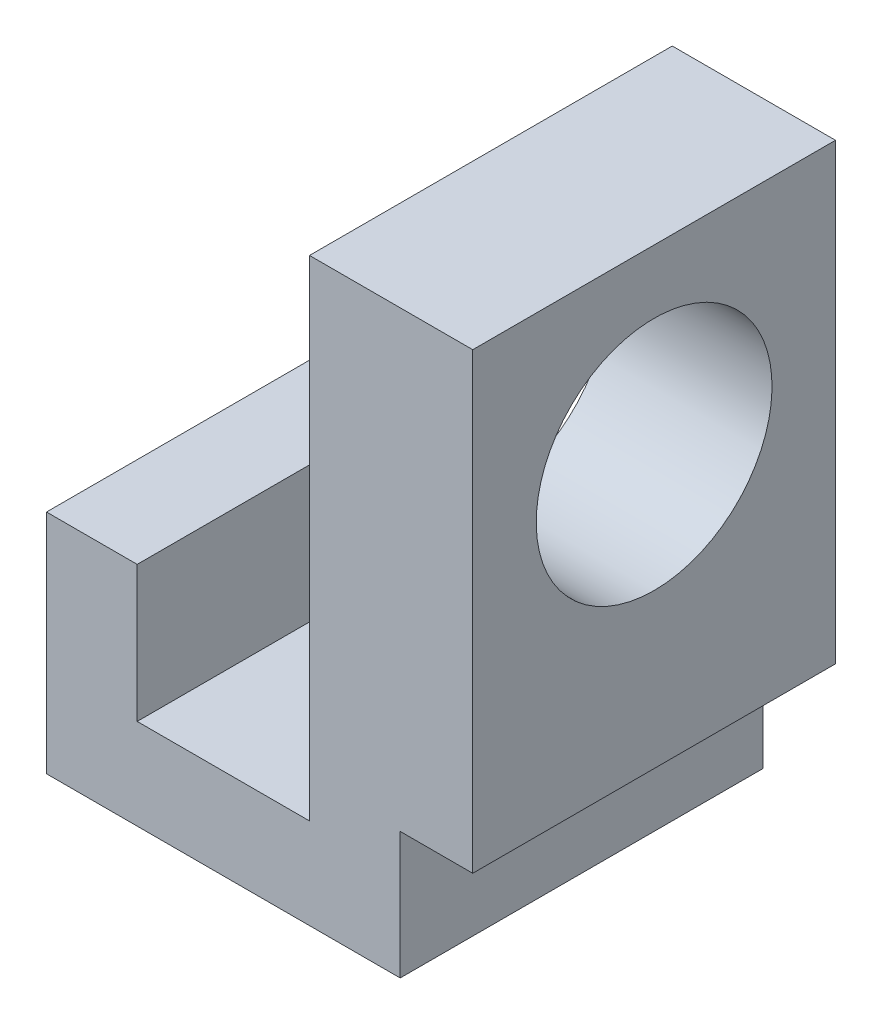
ISO-10303-21;
HEADER;
FILE_DESCRIPTION(('STEP AP214'),'2;1');
FILE_NAME('part.step','',(''),(''),'','','');
FILE_SCHEMA(('AUTOMOTIVE_DESIGN { 1 0 10303 214 1 1 1 1 }'));
ENDSEC;
DATA;
#1=APPLICATION_CONTEXT('core data for automotive mechanical design processes');
#2=APPLICATION_PROTOCOL_DEFINITION('international standard','automotive_design',2000,#1);
#3=PRODUCT_CONTEXT('',#1,'mechanical');
#4=PRODUCT('Part','Part','',(#3));
#5=PRODUCT_RELATED_PRODUCT_CATEGORY('part','',(#4));
#6=PRODUCT_DEFINITION_FORMATION('','',#4);
#7=PRODUCT_DEFINITION_CONTEXT('part definition',#1,'design');
#8=PRODUCT_DEFINITION('design','',#6,#7);
#9=PRODUCT_DEFINITION_SHAPE('','',#8);
#10=(LENGTH_UNIT() NAMED_UNIT(*) SI_UNIT(.MILLI.,.METRE.));
#11=(NAMED_UNIT(*) PLANE_ANGLE_UNIT() SI_UNIT($,.RADIAN.));
#12=(NAMED_UNIT(*) SI_UNIT($,.STERADIAN.) SOLID_ANGLE_UNIT());
#13=UNCERTAINTY_MEASURE_WITH_UNIT(LENGTH_MEASURE(1.E-05),#10,'distance_accuracy_value','');
#14=(GEOMETRIC_REPRESENTATION_CONTEXT(3) GLOBAL_UNCERTAINTY_ASSIGNED_CONTEXT((#13)) GLOBAL_UNIT_ASSIGNED_CONTEXT((#10,
#11,#12)) REPRESENTATION_CONTEXT('',''));
#15=CARTESIAN_POINT('',(0.,0.,0.));
#16=DIRECTION('',(0.,0.,1.));
#17=DIRECTION('',(1.,0.,0.));
#18=AXIS2_PLACEMENT_3D('',#15,#16,#17);
#19=CARTESIAN_POINT('',(0.,25.,-40.));
#20=DIRECTION('',(-1.,0.,0.));
#21=DIRECTION('',(0.,-1.,0.));
#22=AXIS2_PLACEMENT_3D('',#19,#20,#21);
#23=PLANE('',#22);
#24=DIRECTION('',(0.,-1.,0.));
#25=VECTOR('',#24,1.);
#26=CARTESIAN_POINT('',(0.,25.,0.));
#27=LINE('',#26,#25);
#28=CARTESIAN_POINT('',(0.,25.,0.));
#29=VERTEX_POINT('',#28);
#30=CARTESIAN_POINT('',(0.,0.,0.));
#31=VERTEX_POINT('',#30);
#32=EDGE_CURVE('E142',#29,#31,#27,.T.);
#33=ORIENTED_EDGE('',*,*,#32,.F.);
#34=DIRECTION('',(0.,0.,1.));
#35=VECTOR('',#34,1.);
#36=CARTESIAN_POINT('',(0.,25.,-40.));
#37=LINE('',#36,#35);
#38=CARTESIAN_POINT('',(0.,25.,-40.));
#39=VERTEX_POINT('',#38);
#40=EDGE_CURVE('E11',#39,#29,#37,.T.);
#41=ORIENTED_EDGE('',*,*,#40,.F.);
#42=DIRECTION('',(0.,-1.,0.));
#43=VECTOR('',#42,1.);
#44=CARTESIAN_POINT('',(0.,25.,-40.));
#45=LINE('',#44,#43);
#46=CARTESIAN_POINT('',(0.,0.,-40.));
#47=VERTEX_POINT('',#46);
#48=EDGE_CURVE('E169',#39,#47,#45,.T.);
#49=ORIENTED_EDGE('',*,*,#48,.T.);
#50=DIRECTION('',(0.,0.,1.));
#51=VECTOR('',#50,1.);
#52=CARTESIAN_POINT('',(0.,0.,-40.));
#53=LINE('',#52,#51);
#54=EDGE_CURVE('E36',#47,#31,#53,.T.);
#55=ORIENTED_EDGE('',*,*,#54,.T.);
#56=EDGE_LOOP('',(#33,#41,#49,#55));
#57=FACE_BOUND('',#56,.T.);
#58=ADVANCED_FACE('F33',(#57),#23,.T.);
#59=CARTESIAN_POINT('',(10.,25.,-40.));
#60=DIRECTION('',(0.,1.,0.));
#61=DIRECTION('',(0.,0.,1.));
#62=AXIS2_PLACEMENT_3D('',#59,#60,#61);
#63=PLANE('',#62);
#64=DIRECTION('',(-1.,0.,0.));
#65=VECTOR('',#64,1.);
#66=CARTESIAN_POINT('',(10.,25.,0.));
#67=LINE('',#66,#65);
#68=CARTESIAN_POINT('',(10.,25.,0.));
#69=VERTEX_POINT('',#68);
#70=EDGE_CURVE('E167',#69,#29,#67,.T.);
#71=ORIENTED_EDGE('',*,*,#70,.F.);
#72=DIRECTION('',(0.,0.,1.));
#73=VECTOR('',#72,1.);
#74=CARTESIAN_POINT('',(10.,25.,-40.));
#75=LINE('',#74,#73);
#76=CARTESIAN_POINT('',(10.,25.,-40.));
#77=VERTEX_POINT('',#76);
#78=EDGE_CURVE('E42',#77,#69,#75,.T.);
#79=ORIENTED_EDGE('',*,*,#78,.F.);
#80=DIRECTION('',(-1.,0.,0.));
#81=VECTOR('',#80,1.);
#82=CARTESIAN_POINT('',(10.,25.,-40.));
#83=LINE('',#82,#81);
#84=EDGE_CURVE('E132',#77,#39,#83,.T.);
#85=ORIENTED_EDGE('',*,*,#84,.T.);
#86=ORIENTED_EDGE('',*,*,#40,.T.);
#87=EDGE_LOOP('',(#71,#79,#85,#86));
#88=FACE_BOUND('',#87,.T.);
#89=ADVANCED_FACE('F185',(#88),#63,.T.);
#90=CARTESIAN_POINT('',(10.,10.,-40.));
#91=DIRECTION('',(1.,0.,0.));
#92=DIRECTION('',(0.,0.,-1.));
#93=AXIS2_PLACEMENT_3D('',#90,#91,#92);
#94=PLANE('',#93);
#95=DIRECTION('',(0.,1.,0.));
#96=VECTOR('',#95,1.);
#97=CARTESIAN_POINT('',(10.,10.,0.));
#98=LINE('',#97,#96);
#99=CARTESIAN_POINT('',(10.,10.,0.));
#100=VERTEX_POINT('',#99);
#101=EDGE_CURVE('E119',#100,#69,#98,.T.);
#102=ORIENTED_EDGE('',*,*,#101,.F.);
#103=DIRECTION('',(0.,0.,1.));
#104=VECTOR('',#103,1.);
#105=CARTESIAN_POINT('',(10.,10.,-40.));
#106=LINE('',#105,#104);
#107=CARTESIAN_POINT('',(10.,10.,-40.));
#108=VERTEX_POINT('',#107);
#109=EDGE_CURVE('E114',#108,#100,#106,.T.);
#110=ORIENTED_EDGE('',*,*,#109,.F.);
#111=DIRECTION('',(0.,1.,0.));
#112=VECTOR('',#111,1.);
#113=CARTESIAN_POINT('',(10.,10.,-40.));
#114=LINE('',#113,#112);
#115=EDGE_CURVE('E117',#108,#77,#114,.T.);
#116=ORIENTED_EDGE('',*,*,#115,.T.);
#117=ORIENTED_EDGE('',*,*,#78,.T.);
#118=EDGE_LOOP('',(#102,#110,#116,#117));
#119=FACE_BOUND('',#118,.T.);
#120=ADVANCED_FACE('F116',(#119),#94,.T.);
#121=CARTESIAN_POINT('',(29.,10.,-40.));
#122=DIRECTION('',(0.,1.,0.));
#123=DIRECTION('',(-1.,0.,0.));
#124=AXIS2_PLACEMENT_3D('',#121,#122,#123);
#125=PLANE('',#124);
#126=DIRECTION('',(-1.,0.,0.));
#127=VECTOR('',#126,1.);
#128=CARTESIAN_POINT('',(29.,10.,0.));
#129=LINE('',#128,#127);
#130=CARTESIAN_POINT('',(29.,10.,0.));
#131=VERTEX_POINT('',#130);
#132=EDGE_CURVE('E164',#131,#100,#129,.T.);
#133=ORIENTED_EDGE('',*,*,#132,.F.);
#134=DIRECTION('',(0.,0.,1.));
#135=VECTOR('',#134,1.);
#136=CARTESIAN_POINT('',(29.,10.,-40.));
#137=LINE('',#136,#135);
#138=CARTESIAN_POINT('',(29.,10.,-40.));
#139=VERTEX_POINT('',#138);
#140=EDGE_CURVE('E124',#139,#131,#137,.T.);
#141=ORIENTED_EDGE('',*,*,#140,.F.);
#142=DIRECTION('',(-1.,0.,0.));
#143=VECTOR('',#142,1.);
#144=CARTESIAN_POINT('',(29.,10.,-40.));
#145=LINE('',#144,#143);
#146=EDGE_CURVE('E130',#139,#108,#145,.T.);
#147=ORIENTED_EDGE('',*,*,#146,.T.);
#148=ORIENTED_EDGE('',*,*,#109,.T.);
#149=EDGE_LOOP('',(#133,#141,#147,#148));
#150=FACE_BOUND('',#149,.T.);
#151=ADVANCED_FACE('F134',(#150),#125,.T.);
#152=CARTESIAN_POINT('',(29.,64.,-40.));
#153=DIRECTION('',(-1.,0.,0.));
#154=DIRECTION('',(0.,-1.,0.));
#155=AXIS2_PLACEMENT_3D('',#152,#153,#154);
#156=PLANE('',#155);
#157=CARTESIAN_POINT('',(29.,44.,-20.));
#158=DIRECTION('',(-1.,0.,0.));
#159=DIRECTION('',(0.,-1.,0.));
#160=AXIS2_PLACEMENT_3D('',#157,#158,#159);
#161=CIRCLE('',#160,13.);
#162=CARTESIAN_POINT('',(29.,31.,-20.));
#163=VERTEX_POINT('',#162);
#164=EDGE_CURVE('E235',#163,#163,#161,.T.);
#165=ORIENTED_EDGE('',*,*,#164,.F.);
#166=EDGE_LOOP('',(#165));
#167=FACE_BOUND('',#166,.T.);
#168=DIRECTION('',(0.,-1.,0.));
#169=VECTOR('',#168,1.);
#170=CARTESIAN_POINT('',(29.,64.,0.));
#171=LINE('',#170,#169);
#172=CARTESIAN_POINT('',(29.,64.,0.));
#173=VERTEX_POINT('',#172);
#174=EDGE_CURVE('E161',#173,#131,#171,.T.);
#175=ORIENTED_EDGE('',*,*,#174,.F.);
#176=DIRECTION('',(0.,0.,1.));
#177=VECTOR('',#176,1.);
#178=CARTESIAN_POINT('',(29.,64.,-40.));
#179=LINE('',#178,#177);
#180=CARTESIAN_POINT('',(29.,64.,-40.));
#181=VERTEX_POINT('',#180);
#182=EDGE_CURVE('E173',#181,#173,#179,.T.);
#183=ORIENTED_EDGE('',*,*,#182,.F.);
#184=DIRECTION('',(0.,-1.,0.));
#185=VECTOR('',#184,1.);
#186=CARTESIAN_POINT('',(29.,64.,-40.));
#187=LINE('',#186,#185);
#188=EDGE_CURVE('E135',#181,#139,#187,.T.);
#189=ORIENTED_EDGE('',*,*,#188,.T.);
#190=ORIENTED_EDGE('',*,*,#140,.T.);
#191=EDGE_LOOP('',(#175,#183,#189,#190));
#192=FACE_BOUND('',#191,.T.);
#193=ADVANCED_FACE('F198',(#167,#192),#156,.T.);
#194=CARTESIAN_POINT('',(47.,64.,-40.));
#195=DIRECTION('',(0.,1.,0.));
#196=DIRECTION('',(0.,0.,1.));
#197=AXIS2_PLACEMENT_3D('',#194,#195,#196);
#198=PLANE('',#197);
#199=DIRECTION('',(-1.,0.,0.));
#200=VECTOR('',#199,1.);
#201=CARTESIAN_POINT('',(47.,64.,0.));
#202=LINE('',#201,#200);
#203=CARTESIAN_POINT('',(47.,64.,0.));
#204=VERTEX_POINT('',#203);
#205=EDGE_CURVE('E158',#204,#173,#202,.T.);
#206=ORIENTED_EDGE('',*,*,#205,.F.);
#207=DIRECTION('',(0.,0.,1.));
#208=VECTOR('',#207,1.);
#209=CARTESIAN_POINT('',(47.,64.,-40.));
#210=LINE('',#209,#208);
#211=CARTESIAN_POINT('',(47.,64.,-40.));
#212=VERTEX_POINT('',#211);
#213=EDGE_CURVE('E175',#212,#204,#210,.T.);
#214=ORIENTED_EDGE('',*,*,#213,.F.);
#215=DIRECTION('',(-1.,0.,0.));
#216=VECTOR('',#215,1.);
#217=CARTESIAN_POINT('',(47.,64.,-40.));
#218=LINE('',#217,#216);
#219=EDGE_CURVE('E137',#212,#181,#218,.T.);
#220=ORIENTED_EDGE('',*,*,#219,.T.);
#221=ORIENTED_EDGE('',*,*,#182,.T.);
#222=EDGE_LOOP('',(#206,#214,#220,#221));
#223=FACE_BOUND('',#222,.T.);
#224=ADVANCED_FACE('F201',(#223),#198,.T.);
#225=CARTESIAN_POINT('',(47.,14.,-40.));
#226=DIRECTION('',(1.,0.,0.));
#227=DIRECTION('',(0.,0.,-1.));
#228=AXIS2_PLACEMENT_3D('',#225,#226,#227);
#229=PLANE('',#228);
#230=CARTESIAN_POINT('',(47.,44.,-20.));
#231=DIRECTION('',(-1.,0.,0.));
#232=DIRECTION('',(0.,-1.,0.));
#233=AXIS2_PLACEMENT_3D('',#230,#231,#232);
#234=CIRCLE('',#233,13.);
#235=CARTESIAN_POINT('',(47.,31.,-20.));
#236=VERTEX_POINT('',#235);
#237=EDGE_CURVE('E146',#236,#236,#234,.T.);
#238=ORIENTED_EDGE('',*,*,#237,.T.);
#239=EDGE_LOOP('',(#238));
#240=FACE_BOUND('',#239,.T.);
#241=DIRECTION('',(0.,1.,0.));
#242=VECTOR('',#241,1.);
#243=CARTESIAN_POINT('',(47.,14.,0.));
#244=LINE('',#243,#242);
#245=CARTESIAN_POINT('',(47.,14.,0.));
#246=VERTEX_POINT('',#245);
#247=EDGE_CURVE('E155',#246,#204,#244,.T.);
#248=ORIENTED_EDGE('',*,*,#247,.F.);
#249=DIRECTION('',(0.,0.,1.));
#250=VECTOR('',#249,1.);
#251=CARTESIAN_POINT('',(47.,14.,-40.));
#252=LINE('',#251,#250);
#253=CARTESIAN_POINT('',(47.,14.,-40.));
#254=VERTEX_POINT('',#253);
#255=EDGE_CURVE('E177',#254,#246,#252,.T.);
#256=ORIENTED_EDGE('',*,*,#255,.F.);
#257=DIRECTION('',(0.,1.,0.));
#258=VECTOR('',#257,1.);
#259=CARTESIAN_POINT('',(47.,14.,-40.));
#260=LINE('',#259,#258);
#261=EDGE_CURVE('E248',#254,#212,#260,.T.);
#262=ORIENTED_EDGE('',*,*,#261,.T.);
#263=ORIENTED_EDGE('',*,*,#213,.T.);
#264=EDGE_LOOP('',(#248,#256,#262,#263));
#265=FACE_BOUND('',#264,.T.);
#266=ADVANCED_FACE('F205',(#240,#265),#229,.T.);
#267=CARTESIAN_POINT('',(39.,14.,-40.));
#268=DIRECTION('',(0.,-1.,0.));
#269=DIRECTION('',(0.,0.,-1.));
#270=AXIS2_PLACEMENT_3D('',#267,#268,#269);
#271=PLANE('',#270);
#272=DIRECTION('',(1.,0.,0.));
#273=VECTOR('',#272,1.);
#274=CARTESIAN_POINT('',(39.,14.,0.));
#275=LINE('',#274,#273);
#276=CARTESIAN_POINT('',(39.,14.,0.));
#277=VERTEX_POINT('',#276);
#278=EDGE_CURVE('E152',#277,#246,#275,.T.);
#279=ORIENTED_EDGE('',*,*,#278,.F.);
#280=DIRECTION('',(0.,0.,1.));
#281=VECTOR('',#280,1.);
#282=CARTESIAN_POINT('',(39.,14.,-40.));
#283=LINE('',#282,#281);
#284=CARTESIAN_POINT('',(39.,14.,-40.));
#285=VERTEX_POINT('',#284);
#286=EDGE_CURVE('E179',#285,#277,#283,.T.);
#287=ORIENTED_EDGE('',*,*,#286,.F.);
#288=DIRECTION('',(1.,0.,0.));
#289=VECTOR('',#288,1.);
#290=CARTESIAN_POINT('',(39.,14.,-40.));
#291=LINE('',#290,#289);
#292=EDGE_CURVE('E245',#285,#254,#291,.T.);
#293=ORIENTED_EDGE('',*,*,#292,.T.);
#294=ORIENTED_EDGE('',*,*,#255,.T.);
#295=EDGE_LOOP('',(#279,#287,#293,#294));
#296=FACE_BOUND('',#295,.T.);
#297=ADVANCED_FACE('F209',(#296),#271,.T.);
#298=CARTESIAN_POINT('',(39.,0.,-40.));
#299=DIRECTION('',(1.,0.,0.));
#300=DIRECTION('',(0.,1.,0.));
#301=AXIS2_PLACEMENT_3D('',#298,#299,#300);
#302=PLANE('',#301);
#303=DIRECTION('',(0.,1.,0.));
#304=VECTOR('',#303,1.);
#305=CARTESIAN_POINT('',(39.,0.,0.));
#306=LINE('',#305,#304);
#307=CARTESIAN_POINT('',(39.,0.,0.));
#308=VERTEX_POINT('',#307);
#309=EDGE_CURVE('E149',#308,#277,#306,.T.);
#310=ORIENTED_EDGE('',*,*,#309,.F.);
#311=DIRECTION('',(0.,0.,1.));
#312=VECTOR('',#311,1.);
#313=CARTESIAN_POINT('',(39.,0.,-40.));
#314=LINE('',#313,#312);
#315=CARTESIAN_POINT('',(39.,0.,-40.));
#316=VERTEX_POINT('',#315);
#317=EDGE_CURVE('E180',#316,#308,#314,.T.);
#318=ORIENTED_EDGE('',*,*,#317,.F.);
#319=DIRECTION('',(0.,1.,0.));
#320=VECTOR('',#319,1.);
#321=CARTESIAN_POINT('',(39.,0.,-40.));
#322=LINE('',#321,#320);
#323=EDGE_CURVE('E242',#316,#285,#322,.T.);
#324=ORIENTED_EDGE('',*,*,#323,.T.);
#325=ORIENTED_EDGE('',*,*,#286,.T.);
#326=EDGE_LOOP('',(#310,#318,#324,#325));
#327=FACE_BOUND('',#326,.T.);
#328=ADVANCED_FACE('F213',(#327),#302,.T.);
#329=CARTESIAN_POINT('',(0.,0.,-40.));
#330=DIRECTION('',(0.,-1.,0.));
#331=DIRECTION('',(0.,0.,-1.));
#332=AXIS2_PLACEMENT_3D('',#329,#330,#331);
#333=PLANE('',#332);
#334=DIRECTION('',(1.,0.,0.));
#335=VECTOR('',#334,1.);
#336=CARTESIAN_POINT('',(0.,0.,0.));
#337=LINE('',#336,#335);
#338=EDGE_CURVE('E145',#31,#308,#337,.T.);
#339=ORIENTED_EDGE('',*,*,#338,.F.);
#340=ORIENTED_EDGE('',*,*,#54,.F.);
#341=DIRECTION('',(1.,0.,0.));
#342=VECTOR('',#341,1.);
#343=CARTESIAN_POINT('',(0.,0.,-40.));
#344=LINE('',#343,#342);
#345=EDGE_CURVE('E240',#47,#316,#344,.T.);
#346=ORIENTED_EDGE('',*,*,#345,.T.);
#347=ORIENTED_EDGE('',*,*,#317,.T.);
#348=EDGE_LOOP('',(#339,#340,#346,#347));
#349=FACE_BOUND('',#348,.T.);
#350=ADVANCED_FACE('F182',(#349),#333,.T.);
#351=CARTESIAN_POINT('',(0.,0.,-40.));
#352=DIRECTION('',(0.,0.,1.));
#353=DIRECTION('',(1.,0.,0.));
#354=AXIS2_PLACEMENT_3D('',#351,#352,#353);
#355=PLANE('',#354);
#356=ORIENTED_EDGE('',*,*,#48,.F.);
#357=ORIENTED_EDGE('',*,*,#84,.F.);
#358=ORIENTED_EDGE('',*,*,#115,.F.);
#359=ORIENTED_EDGE('',*,*,#146,.F.);
#360=ORIENTED_EDGE('',*,*,#188,.F.);
#361=ORIENTED_EDGE('',*,*,#219,.F.);
#362=ORIENTED_EDGE('',*,*,#261,.F.);
#363=ORIENTED_EDGE('',*,*,#292,.F.);
#364=ORIENTED_EDGE('',*,*,#323,.F.);
#365=ORIENTED_EDGE('',*,*,#345,.F.);
#366=EDGE_LOOP('',(#356,#357,#358,#359,#360,#361,#362,#363,#364,#365));
#367=FACE_BOUND('',#366,.T.);
#368=ADVANCED_FACE('F128',(#367),#355,.F.);
#369=CARTESIAN_POINT('',(0.,0.,0.));
#370=DIRECTION('',(0.,0.,1.));
#371=DIRECTION('',(1.,0.,0.));
#372=AXIS2_PLACEMENT_3D('',#369,#370,#371);
#373=PLANE('',#372);
#374=ORIENTED_EDGE('',*,*,#32,.T.);
#375=ORIENTED_EDGE('',*,*,#338,.T.);
#376=ORIENTED_EDGE('',*,*,#309,.T.);
#377=ORIENTED_EDGE('',*,*,#278,.T.);
#378=ORIENTED_EDGE('',*,*,#247,.T.);
#379=ORIENTED_EDGE('',*,*,#205,.T.);
#380=ORIENTED_EDGE('',*,*,#174,.T.);
#381=ORIENTED_EDGE('',*,*,#132,.T.);
#382=ORIENTED_EDGE('',*,*,#101,.T.);
#383=ORIENTED_EDGE('',*,*,#70,.T.);
#384=EDGE_LOOP('',(#374,#375,#376,#377,#378,#379,#380,#381,#382,#383));
#385=FACE_BOUND('',#384,.T.);
#386=ADVANCED_FACE('F184',(#385),#373,.T.);
#387=CARTESIAN_POINT('',(47.,44.,-20.));
#388=DIRECTION('',(-1.,0.,0.));
#389=DIRECTION('',(0.,-1.,0.));
#390=AXIS2_PLACEMENT_3D('',#387,#388,#389);
#391=CYLINDRICAL_SURFACE('',#390,13.);
#392=ORIENTED_EDGE('',*,*,#237,.F.);
#393=EDGE_LOOP('',(#392));
#394=FACE_BOUND('',#393,.T.);
#395=ORIENTED_EDGE('',*,*,#164,.T.);
#396=EDGE_LOOP('',(#395));
#397=FACE_BOUND('',#396,.T.);
#398=ADVANCED_FACE('F224',(#394,#397),#391,.F.);
#399=CLOSED_SHELL('',(#58,#89,#120,#151,#193,#224,#266,#297,#328,#350,#368,#386,#398));
#400=MANIFOLD_SOLID_BREP('B2',#399);
#401=ADVANCED_BREP_SHAPE_REPRESENTATION('',(#18,#400),#14);
#402=SHAPE_DEFINITION_REPRESENTATION(#9,#401);
ENDSEC;
END-ISO-10303-21;
